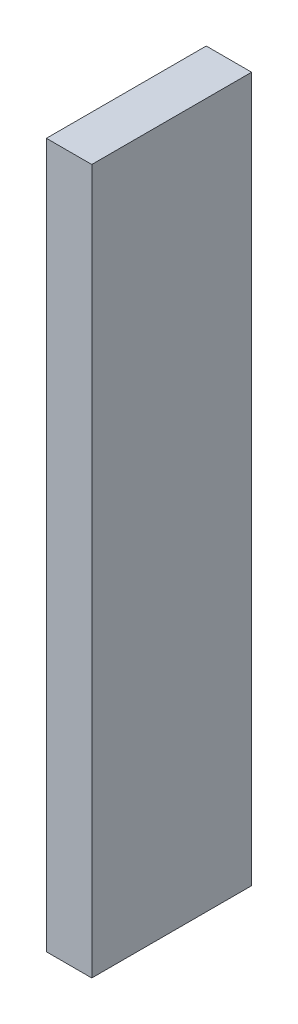
ISO-10303-21;
HEADER;
FILE_DESCRIPTION(('STEP AP214'),'2;1');
FILE_NAME('part.step','',(''),(''),'','','');
FILE_SCHEMA(('AUTOMOTIVE_DESIGN { 1 0 10303 214 1 1 1 1 }'));
ENDSEC;
DATA;
#1=APPLICATION_CONTEXT('core data for automotive mechanical design processes');
#2=APPLICATION_PROTOCOL_DEFINITION('international standard','automotive_design',2000,#1);
#3=PRODUCT_CONTEXT('',#1,'mechanical');
#4=PRODUCT('Part','Part','',(#3));
#5=PRODUCT_RELATED_PRODUCT_CATEGORY('part','',(#4));
#6=PRODUCT_DEFINITION_FORMATION('','',#4);
#7=PRODUCT_DEFINITION_CONTEXT('part definition',#1,'design');
#8=PRODUCT_DEFINITION('design','',#6,#7);
#9=PRODUCT_DEFINITION_SHAPE('','',#8);
#10=(LENGTH_UNIT() NAMED_UNIT(*) SI_UNIT(.MILLI.,.METRE.));
#11=(NAMED_UNIT(*) PLANE_ANGLE_UNIT() SI_UNIT($,.RADIAN.));
#12=(NAMED_UNIT(*) SI_UNIT($,.STERADIAN.) SOLID_ANGLE_UNIT());
#13=UNCERTAINTY_MEASURE_WITH_UNIT(LENGTH_MEASURE(1.E-05),#10,'distance_accuracy_value','');
#14=(GEOMETRIC_REPRESENTATION_CONTEXT(3) GLOBAL_UNCERTAINTY_ASSIGNED_CONTEXT((#13)) GLOBAL_UNIT_ASSIGNED_CONTEXT((#10,
#11,#12)) REPRESENTATION_CONTEXT('',''));
#15=CARTESIAN_POINT('',(0.,0.,0.));
#16=DIRECTION('',(0.,0.,1.));
#17=DIRECTION('',(1.,0.,0.));
#18=AXIS2_PLACEMENT_3D('',#15,#16,#17);
#19=CARTESIAN_POINT('',(-52.5,96.3786,78.03));
#20=DIRECTION('',(-1.,0.,0.));
#21=DIRECTION('',(0.,-1.,0.));
#22=AXIS2_PLACEMENT_3D('',#19,#20,#21);
#23=PLANE('',#22);
#24=DIRECTION('',(0.,0.,-1.));
#25=VECTOR('',#24,1.);
#26=CARTESIAN_POINT('',(-52.5,19.95,86.87));
#27=LINE('',#26,#25);
#28=CARTESIAN_POINT('',(-52.5,19.95,95.37));
#29=VERTEX_POINT('',#28);
#30=CARTESIAN_POINT('',(-52.5,19.95,78.37));
#31=VERTEX_POINT('',#30);
#32=EDGE_CURVE('E53',#29,#31,#27,.T.);
#33=ORIENTED_EDGE('',*,*,#32,.F.);
#34=DIRECTION('',(0.,-1.,0.));
#35=VECTOR('',#34,1.);
#36=CARTESIAN_POINT('',(-52.5,57.415,95.37));
#37=LINE('',#36,#35);
#38=CARTESIAN_POINT('',(-52.5,94.88,95.37));
#39=VERTEX_POINT('',#38);
#40=EDGE_CURVE('E68',#39,#29,#37,.T.);
#41=ORIENTED_EDGE('',*,*,#40,.F.);
#42=DIRECTION('',(0.,0.,1.));
#43=VECTOR('',#42,1.);
#44=CARTESIAN_POINT('',(-52.5,94.88,86.87));
#45=LINE('',#44,#43);
#46=CARTESIAN_POINT('',(-52.5,94.88,78.37));
#47=VERTEX_POINT('',#46);
#48=EDGE_CURVE('E20',#47,#39,#45,.T.);
#49=ORIENTED_EDGE('',*,*,#48,.F.);
#50=DIRECTION('',(0.,1.,0.));
#51=VECTOR('',#50,1.);
#52=CARTESIAN_POINT('',(-52.5,57.415,78.37));
#53=LINE('',#52,#51);
#54=EDGE_CURVE('E58',#31,#47,#53,.T.);
#55=ORIENTED_EDGE('',*,*,#54,.F.);
#56=EDGE_LOOP('',(#33,#41,#49,#55));
#57=FACE_BOUND('',#56,.T.);
#58=ADVANCED_FACE('F16',(#57),#23,.T.);
#59=CARTESIAN_POINT('',(-47.57748,94.88,95.71));
#60=DIRECTION('',(0.,1.,0.));
#61=DIRECTION('',(0.,0.,-1.));
#62=AXIS2_PLACEMENT_3D('',#59,#60,#61);
#63=PLANE('',#62);
#64=ORIENTED_EDGE('',*,*,#48,.T.);
#65=DIRECTION('',(-1.,0.,0.));
#66=VECTOR('',#65,1.);
#67=CARTESIAN_POINT('',(-50.087,94.88,95.37));
#68=LINE('',#67,#66);
#69=CARTESIAN_POINT('',(-47.674,94.88,95.37));
#70=VERTEX_POINT('',#69);
#71=EDGE_CURVE('E79',#70,#39,#68,.T.);
#72=ORIENTED_EDGE('',*,*,#71,.F.);
#73=DIRECTION('',(0.,0.,-1.));
#74=VECTOR('',#73,1.);
#75=CARTESIAN_POINT('',(-47.674,94.88,86.87));
#76=LINE('',#75,#74);
#77=CARTESIAN_POINT('',(-47.674,94.88,78.37));
#78=VERTEX_POINT('',#77);
#79=EDGE_CURVE('E74',#70,#78,#76,.T.);
#80=ORIENTED_EDGE('',*,*,#79,.T.);
#81=DIRECTION('',(1.,0.,0.));
#82=VECTOR('',#81,1.);
#83=CARTESIAN_POINT('',(-50.087,94.88,78.37));
#84=LINE('',#83,#82);
#85=EDGE_CURVE('E63',#47,#78,#84,.T.);
#86=ORIENTED_EDGE('',*,*,#85,.F.);
#87=EDGE_LOOP('',(#64,#72,#80,#86));
#88=FACE_BOUND('',#87,.T.);
#89=ADVANCED_FACE('F73',(#88),#63,.T.);
#90=CARTESIAN_POINT('',(-47.57748,96.3786,78.37));
#91=DIRECTION('',(0.,0.,-1.));
#92=DIRECTION('',(0.,-1.,0.));
#93=AXIS2_PLACEMENT_3D('',#90,#91,#92);
#94=PLANE('',#93);
#95=ORIENTED_EDGE('',*,*,#54,.T.);
#96=ORIENTED_EDGE('',*,*,#85,.T.);
#97=DIRECTION('',(0.,-1.,0.));
#98=VECTOR('',#97,1.);
#99=CARTESIAN_POINT('',(-47.674,57.415,78.37));
#100=LINE('',#99,#98);
#101=CARTESIAN_POINT('',(-47.674,19.95,78.37));
#102=VERTEX_POINT('',#101);
#103=EDGE_CURVE('E84',#78,#102,#100,.T.);
#104=ORIENTED_EDGE('',*,*,#103,.T.);
#105=DIRECTION('',(1.,0.,0.));
#106=VECTOR('',#105,1.);
#107=CARTESIAN_POINT('',(-50.087,19.95,78.37));
#108=LINE('',#107,#106);
#109=EDGE_CURVE('E65',#31,#102,#108,.T.);
#110=ORIENTED_EDGE('',*,*,#109,.F.);
#111=EDGE_LOOP('',(#95,#96,#104,#110));
#112=FACE_BOUND('',#111,.T.);
#113=ADVANCED_FACE('F60',(#112),#94,.T.);
#114=CARTESIAN_POINT('',(-47.57748,19.95,78.03));
#115=DIRECTION('',(0.,-1.,0.));
#116=DIRECTION('',(0.,0.,1.));
#117=AXIS2_PLACEMENT_3D('',#114,#115,#116);
#118=PLANE('',#117);
#119=ORIENTED_EDGE('',*,*,#32,.T.);
#120=ORIENTED_EDGE('',*,*,#109,.T.);
#121=DIRECTION('',(0.,0.,1.));
#122=VECTOR('',#121,1.);
#123=CARTESIAN_POINT('',(-47.674,19.95,86.87));
#124=LINE('',#123,#122);
#125=CARTESIAN_POINT('',(-47.674,19.95,95.37));
#126=VERTEX_POINT('',#125);
#127=EDGE_CURVE('E26',#102,#126,#124,.T.);
#128=ORIENTED_EDGE('',*,*,#127,.T.);
#129=DIRECTION('',(1.,0.,0.));
#130=VECTOR('',#129,1.);
#131=CARTESIAN_POINT('',(-50.087,19.95,95.37));
#132=LINE('',#131,#130);
#133=EDGE_CURVE('E34',#29,#126,#132,.T.);
#134=ORIENTED_EDGE('',*,*,#133,.F.);
#135=EDGE_LOOP('',(#119,#120,#128,#134));
#136=FACE_BOUND('',#135,.T.);
#137=ADVANCED_FACE('F88',(#136),#118,.T.);
#138=CARTESIAN_POINT('',(-47.57748,18.4514,95.37));
#139=DIRECTION('',(0.,0.,1.));
#140=DIRECTION('',(0.,1.,0.));
#141=AXIS2_PLACEMENT_3D('',#138,#139,#140);
#142=PLANE('',#141);
#143=ORIENTED_EDGE('',*,*,#40,.T.);
#144=ORIENTED_EDGE('',*,*,#133,.T.);
#145=DIRECTION('',(0.,1.,0.));
#146=VECTOR('',#145,1.);
#147=CARTESIAN_POINT('',(-47.674,57.415,95.37));
#148=LINE('',#147,#146);
#149=EDGE_CURVE('E11',#126,#70,#148,.T.);
#150=ORIENTED_EDGE('',*,*,#149,.T.);
#151=ORIENTED_EDGE('',*,*,#71,.T.);
#152=EDGE_LOOP('',(#143,#144,#150,#151));
#153=FACE_BOUND('',#152,.T.);
#154=ADVANCED_FACE('F90',(#153),#142,.T.);
#155=CARTESIAN_POINT('',(-47.674,96.3786,78.03));
#156=DIRECTION('',(-1.,0.,0.));
#157=DIRECTION('',(0.,-1.,0.));
#158=AXIS2_PLACEMENT_3D('',#155,#156,#157);
#159=PLANE('',#158);
#160=ORIENTED_EDGE('',*,*,#127,.F.);
#161=ORIENTED_EDGE('',*,*,#103,.F.);
#162=ORIENTED_EDGE('',*,*,#79,.F.);
#163=ORIENTED_EDGE('',*,*,#149,.F.);
#164=EDGE_LOOP('',(#160,#161,#162,#163));
#165=FACE_BOUND('',#164,.T.);
#166=ADVANCED_FACE('F18',(#165),#159,.F.);
#167=CLOSED_SHELL('',(#58,#89,#113,#137,#154,#166));
#168=MANIFOLD_SOLID_BREP('B1',#167);
#169=ADVANCED_BREP_SHAPE_REPRESENTATION('',(#18,#168),#14);
#170=SHAPE_DEFINITION_REPRESENTATION(#9,#169);
ENDSEC;
END-ISO-10303-21;
